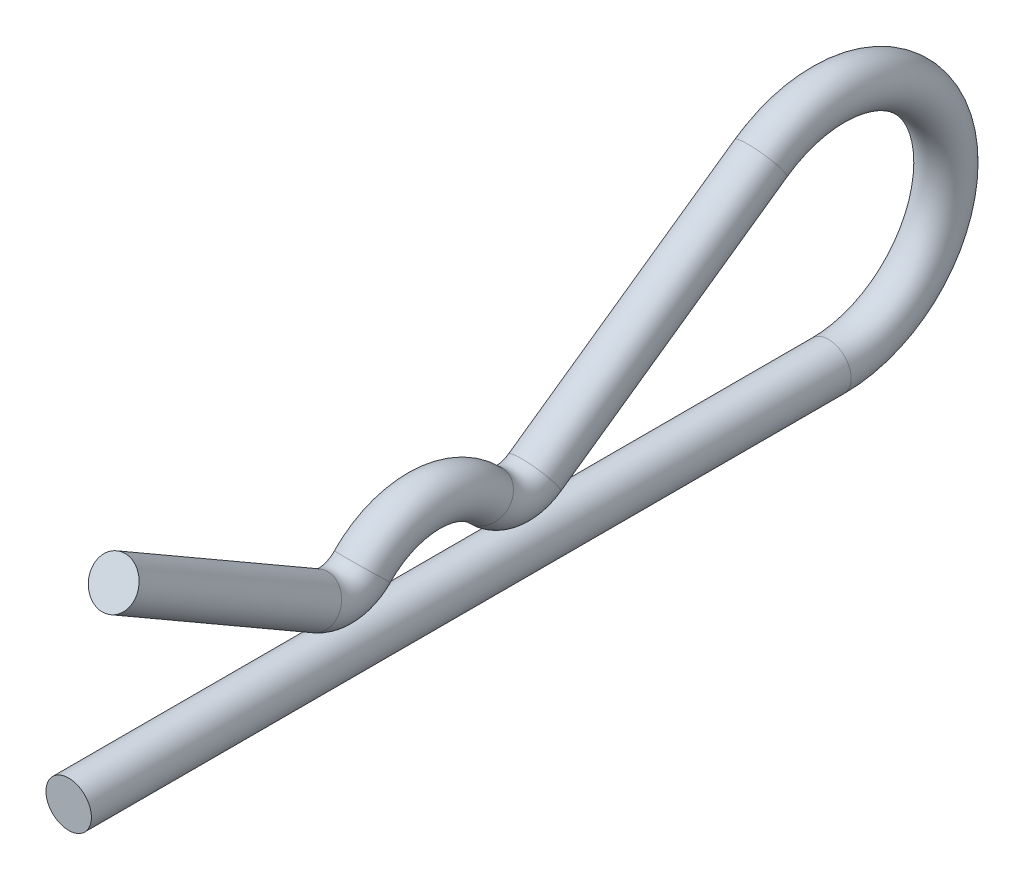
ISO-10303-21;
HEADER;
FILE_DESCRIPTION(('STEP AP214'),'2;1');
FILE_NAME('part.step','',(''),(''),'','','');
FILE_SCHEMA(('AUTOMOTIVE_DESIGN { 1 0 10303 214 1 1 1 1 }'));
ENDSEC;
DATA;
#1=APPLICATION_CONTEXT('core data for automotive mechanical design processes');
#2=APPLICATION_PROTOCOL_DEFINITION('international standard','automotive_design',2000,#1);
#3=PRODUCT_CONTEXT('',#1,'mechanical');
#4=PRODUCT('Part','Part','',(#3));
#5=PRODUCT_RELATED_PRODUCT_CATEGORY('part','',(#4));
#6=PRODUCT_DEFINITION_FORMATION('','',#4);
#7=PRODUCT_DEFINITION_CONTEXT('part definition',#1,'design');
#8=PRODUCT_DEFINITION('design','',#6,#7);
#9=PRODUCT_DEFINITION_SHAPE('','',#8);
#10=(LENGTH_UNIT() NAMED_UNIT(*) SI_UNIT(.MILLI.,.METRE.));
#11=(NAMED_UNIT(*) PLANE_ANGLE_UNIT() SI_UNIT($,.RADIAN.));
#12=(NAMED_UNIT(*) SI_UNIT($,.STERADIAN.) SOLID_ANGLE_UNIT());
#13=UNCERTAINTY_MEASURE_WITH_UNIT(LENGTH_MEASURE(1.E-05),#10,'distance_accuracy_value','');
#14=(GEOMETRIC_REPRESENTATION_CONTEXT(3) GLOBAL_UNCERTAINTY_ASSIGNED_CONTEXT((#13)) GLOBAL_UNIT_ASSIGNED_CONTEXT((#10,
#11,#12)) REPRESENTATION_CONTEXT('',''));
#15=CARTESIAN_POINT('',(0.,0.,0.));
#16=DIRECTION('',(0.,0.,1.));
#17=DIRECTION('',(1.,0.,0.));
#18=AXIS2_PLACEMENT_3D('',#15,#16,#17);
#19=CARTESIAN_POINT('',(0.,-1.9685,7.5438));
#20=DIRECTION('',(0.,0.,1.));
#21=DIRECTION('',(1.,0.,0.));
#22=AXIS2_PLACEMENT_3D('',#19,#20,#21);
#23=PLANE('',#22);
#24=CARTESIAN_POINT('',(0.,-1.9685,7.5438));
#25=DIRECTION('',(0.,0.,1.));
#26=DIRECTION('',(1.,0.,0.));
#27=AXIS2_PLACEMENT_3D('',#24,#25,#26);
#28=CIRCLE('',#27,0.380999999999999);
#29=CARTESIAN_POINT('',(0.380999999999999,-1.9685,7.5438));
#30=VERTEX_POINT('',#29);
#31=EDGE_CURVE('E52',#30,#30,#28,.T.);
#32=ORIENTED_EDGE('',*,*,#31,.T.);
#33=EDGE_LOOP('',(#32));
#34=FACE_BOUND('',#33,.T.);
#35=ADVANCED_FACE('F41',(#34),#23,.T.);
#36=CARTESIAN_POINT('',(0.,0.870570192058864,6.78942));
#37=DIRECTION('',(0.,-0.499999999999991,-0.866025403784444));
#38=DIRECTION('',(1.,0.,0.));
#39=AXIS2_PLACEMENT_3D('',#36,#37,#38);
#40=PLANE('',#39);
#41=CARTESIAN_POINT('',(0.,0.870570192058864,6.78942));
#42=DIRECTION('',(0.,-0.499999999999991,-0.866025403784444));
#43=DIRECTION('',(1.,0.,0.));
#44=AXIS2_PLACEMENT_3D('',#41,#42,#43);
#45=CIRCLE('',#44,0.380999999999999);
#46=CARTESIAN_POINT('',(0.380999999999999,0.870570192058864,6.78942));
#47=VERTEX_POINT('',#46);
#48=EDGE_CURVE('E11',#47,#47,#45,.T.);
#49=ORIENTED_EDGE('',*,*,#48,.F.);
#50=EDGE_LOOP('',(#49));
#51=FACE_BOUND('',#50,.T.);
#52=ADVANCED_FACE('F56',(#51),#40,.F.);
#53=CARTESIAN_POINT('',(0.,-1.9685,7.5438));
#54=DIRECTION('',(0.,0.,-1.));
#55=DIRECTION('',(0.,1.,0.));
#56=AXIS2_PLACEMENT_3D('',#53,#54,#55);
#57=CYLINDRICAL_SURFACE('',#56,0.380999999999999);
#58=CARTESIAN_POINT('',(0.,-1.9685,-5.1943));
#59=DIRECTION('',(0.,0.,1.));
#60=DIRECTION('',(1.,0.,0.));
#61=AXIS2_PLACEMENT_3D('',#58,#59,#60);
#62=CIRCLE('',#61,0.380999999999999);
#63=CARTESIAN_POINT('',(0.,-2.3495,-5.1943));
#64=VERTEX_POINT('',#63);
#65=EDGE_CURVE('E103',#64,#64,#62,.T.);
#66=ORIENTED_EDGE('',*,*,#65,.T.);
#67=EDGE_LOOP('',(#66));
#68=FACE_BOUND('',#67,.T.);
#69=ORIENTED_EDGE('',*,*,#31,.F.);
#70=EDGE_LOOP('',(#69));
#71=FACE_BOUND('',#70,.T.);
#72=ADVANCED_FACE('F62',(#68,#71),#57,.T.);
#73=CARTESIAN_POINT('',(0.,0.,-5.1943));
#74=DIRECTION('',(1.,0.,0.));
#75=DIRECTION('',(0.,0.,-1.));
#76=AXIS2_PLACEMENT_3D('',#73,#74,#75);
#77=TOROIDAL_SURFACE('',#76,1.9685,0.380999999999999);
#78=CARTESIAN_POINT('',(0.,1.61008533297902,-4.0617729713928));
#79=DIRECTION('',(0.,0.57532488118222,-0.81792498500331));
#80=DIRECTION('',(1.,0.,0.));
#81=AXIS2_PLACEMENT_3D('',#78,#79,#80);
#82=CIRCLE('',#81,0.380999999999999);
#83=CARTESIAN_POINT('',(0.,1.92171475226528,-3.84257419166238));
#84=VERTEX_POINT('',#83);
#85=EDGE_CURVE('E96',#84,#84,#82,.T.);
#86=CARTESIAN_POINT('',(0.,0.,-5.1943));
#87=DIRECTION('',(1.,0.,0.));
#88=DIRECTION('',(0.,0.,-1.));
#89=AXIS2_PLACEMENT_3D('',#86,#87,#88);
#90=CIRCLE('',#89,2.3495);
#91=EDGE_CURVE('',#64,#84,#90,.T.);
#92=ORIENTED_EDGE('',*,*,#65,.F.);
#93=ORIENTED_EDGE('',*,*,#85,.T.);
#94=ORIENTED_EDGE('',*,*,#91,.T.);
#95=ORIENTED_EDGE('',*,*,#91,.F.);
#96=EDGE_LOOP('',(#92,#94,#93,#95));
#97=FACE_BOUND('',#96,.T.);
#98=ADVANCED_FACE('F68',(#97),#77,.T.);
#99=CARTESIAN_POINT('',(0.,1.61008533297902,-4.0617729713928));
#100=DIRECTION('',(0.,-0.57532488118222,0.817924985003309));
#101=DIRECTION('',(0.,-0.81792498500331,-0.57532488118222));
#102=AXIS2_PLACEMENT_3D('',#99,#100,#101);
#103=CYLINDRICAL_SURFACE('',#102,0.380999999999999);
#104=CARTESIAN_POINT('',(0.,-1.05910691355152,-0.267049155992636));
#105=DIRECTION('',(0.,0.57532488118222,-0.81792498500331));
#106=DIRECTION('',(1.,0.,0.));
#107=AXIS2_PLACEMENT_3D('',#104,#105,#106);
#108=CIRCLE('',#107,0.380999999999999);
#109=CARTESIAN_POINT('',(0.,-1.37073633283778,-0.486247935723062));
#110=VERTEX_POINT('',#109);
#111=EDGE_CURVE('E101',#110,#110,#108,.T.);
#112=ORIENTED_EDGE('',*,*,#111,.T.);
#113=EDGE_LOOP('',(#112));
#114=FACE_BOUND('',#113,.T.);
#115=ORIENTED_EDGE('',*,*,#85,.F.);
#116=EDGE_LOOP('',(#115));
#117=FACE_BOUND('',#116,.T.);
#118=ADVANCED_FACE('F88',(#114,#117),#103,.T.);
#119=CARTESIAN_POINT('',(0.,-0.539724548074419,0.098282143558075));
#120=DIRECTION('',(-1.,0.,0.));
#121=DIRECTION('',(0.,0.,1.));
#122=AXIS2_PLACEMENT_3D('',#119,#120,#121);
#123=TOROIDAL_SURFACE('',#122,0.635,0.380999999999999);
#124=CARTESIAN_POINT('',(0.,-0.979342342309847,0.556497371362191));
#125=DIRECTION('',(0.,-0.72159878394349,-0.692311486984924));
#126=DIRECTION('',(1.,0.,0.));
#127=AXIS2_PLACEMENT_3D('',#124,#125,#126);
#128=CIRCLE('',#127,0.380999999999999);
#129=CARTESIAN_POINT('',(0.,-1.2431130188511,0.83142650804466));
#130=VERTEX_POINT('',#129);
#131=EDGE_CURVE('E107',#130,#130,#128,.T.);
#132=CARTESIAN_POINT('',(0.,-0.539724548074419,0.098282143558075));
#133=DIRECTION('',(-1.,0.,0.));
#134=DIRECTION('',(0.,0.,1.));
#135=AXIS2_PLACEMENT_3D('',#132,#133,#134);
#136=CIRCLE('',#135,1.016);
#137=EDGE_CURVE('',#110,#130,#136,.T.);
#138=ORIENTED_EDGE('',*,*,#111,.F.);
#139=ORIENTED_EDGE('',*,*,#131,.T.);
#140=ORIENTED_EDGE('',*,*,#137,.T.);
#141=ORIENTED_EDGE('',*,*,#137,.F.);
#142=EDGE_LOOP('',(#138,#140,#139,#141));
#143=FACE_BOUND('',#142,.T.);
#144=ADVANCED_FACE('F85',(#143),#123,.T.);
#145=CARTESIAN_POINT('',(0.,-1.9685,1.5875));
#146=DIRECTION('',(1.,0.,0.));
#147=DIRECTION('',(0.,0.,-1.));
#148=AXIS2_PLACEMENT_3D('',#145,#146,#147);
#149=TOROIDAL_SURFACE('',#148,1.42877545192558,0.380999999999999);
#150=CARTESIAN_POINT('',(0.,-0.979342342309847,2.61850262863781));
#151=DIRECTION('',(0.,0.721598783943491,-0.692311486984923));
#152=DIRECTION('',(1.,0.,0.));
#153=AXIS2_PLACEMENT_3D('',#150,#151,#152);
#154=CIRCLE('',#153,0.380999999999999);
#155=CARTESIAN_POINT('',(0.,-1.2431130188511,2.34357349195534));
#156=VERTEX_POINT('',#155);
#157=EDGE_CURVE('E115',#156,#156,#154,.T.);
#158=ORIENTED_EDGE('',*,*,#157,.T.);
#159=EDGE_LOOP('',(#158));
#160=FACE_BOUND('',#159,.T.);
#161=ORIENTED_EDGE('',*,*,#131,.F.);
#162=EDGE_LOOP('',(#161));
#163=FACE_BOUND('',#162,.T.);
#164=ADVANCED_FACE('F77',(#160,#163),#149,.T.);
#165=CARTESIAN_POINT('',(0.,-0.539724548074419,3.07671785644193));
#166=DIRECTION('',(-1.,0.,0.));
#167=DIRECTION('',(0.,0.,1.));
#168=AXIS2_PLACEMENT_3D('',#165,#166,#167);
#169=TOROIDAL_SURFACE('',#168,0.635,0.380999999999999);
#170=CARTESIAN_POINT('',(0.,-1.08965067947754,3.39421785644192));
#171=DIRECTION('',(0.,-0.499999999999992,-0.866025403784443));
#172=DIRECTION('',(1.,0.,0.));
#173=AXIS2_PLACEMENT_3D('',#170,#171,#172);
#174=CIRCLE('',#173,0.380999999999999);
#175=CARTESIAN_POINT('',(0.,-1.41960635831941,3.58471785644192));
#176=VERTEX_POINT('',#175);
#177=EDGE_CURVE('E48',#176,#176,#174,.T.);
#178=CARTESIAN_POINT('',(0.,-0.539724548074419,3.07671785644193));
#179=DIRECTION('',(-1.,0.,0.));
#180=DIRECTION('',(0.,0.,1.));
#181=AXIS2_PLACEMENT_3D('',#178,#179,#180);
#182=CIRCLE('',#181,1.016);
#183=EDGE_CURVE('',#156,#176,#182,.T.);
#184=ORIENTED_EDGE('',*,*,#157,.F.);
#185=ORIENTED_EDGE('',*,*,#177,.T.);
#186=ORIENTED_EDGE('',*,*,#183,.T.);
#187=ORIENTED_EDGE('',*,*,#183,.F.);
#188=EDGE_LOOP('',(#184,#186,#185,#187));
#189=FACE_BOUND('',#188,.T.);
#190=ADVANCED_FACE('F72',(#189),#169,.T.);
#191=CARTESIAN_POINT('',(0.,-1.08965067947754,3.39421785644192));
#192=DIRECTION('',(0.,0.499999999999991,0.866025403784444));
#193=DIRECTION('',(0.,-0.866025403784444,0.499999999999991));
#194=AXIS2_PLACEMENT_3D('',#191,#192,#193);
#195=CYLINDRICAL_SURFACE('',#194,0.380999999999999);
#196=ORIENTED_EDGE('',*,*,#48,.T.);
#197=EDGE_LOOP('',(#196));
#198=FACE_BOUND('',#197,.T.);
#199=ORIENTED_EDGE('',*,*,#177,.F.);
#200=EDGE_LOOP('',(#199));
#201=FACE_BOUND('',#200,.T.);
#202=ADVANCED_FACE('F57',(#198,#201),#195,.T.);
#203=CLOSED_SHELL('',(#35,#52,#72,#98,#118,#144,#164,#190,#202));
#204=MANIFOLD_SOLID_BREP('B2',#203);
#205=ADVANCED_BREP_SHAPE_REPRESENTATION('',(#18,#204),#14);
#206=SHAPE_DEFINITION_REPRESENTATION(#9,#205);
ENDSEC;
END-ISO-10303-21;
